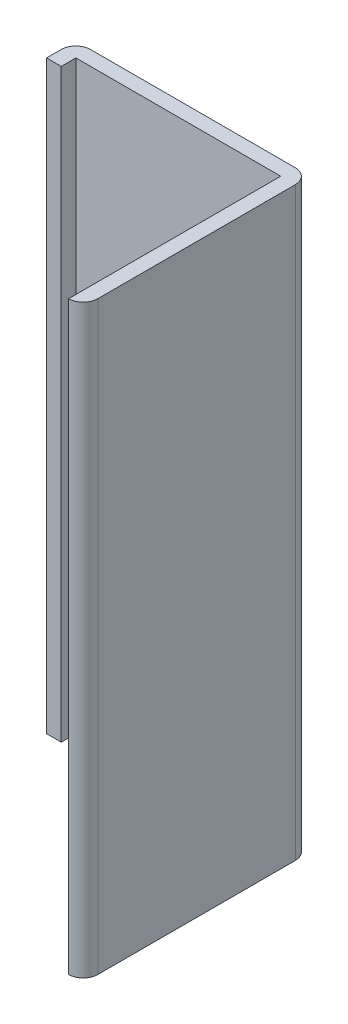
ISO-10303-21;
HEADER;
FILE_DESCRIPTION(('STEP AP214'),'2;1');
FILE_NAME('part.step','',(''),(''),'','','');
FILE_SCHEMA(('AUTOMOTIVE_DESIGN { 1 0 10303 214 1 1 1 1 }'));
ENDSEC;
DATA;
#1=APPLICATION_CONTEXT('core data for automotive mechanical design processes');
#2=APPLICATION_PROTOCOL_DEFINITION('international standard','automotive_design',2000,#1);
#3=PRODUCT_CONTEXT('',#1,'mechanical');
#4=PRODUCT('Part','Part','',(#3));
#5=PRODUCT_RELATED_PRODUCT_CATEGORY('part','',(#4));
#6=PRODUCT_DEFINITION_FORMATION('','',#4);
#7=PRODUCT_DEFINITION_CONTEXT('part definition',#1,'design');
#8=PRODUCT_DEFINITION('design','',#6,#7);
#9=PRODUCT_DEFINITION_SHAPE('','',#8);
#10=(LENGTH_UNIT() NAMED_UNIT(*) SI_UNIT(.MILLI.,.METRE.));
#11=(NAMED_UNIT(*) PLANE_ANGLE_UNIT() SI_UNIT($,.RADIAN.));
#12=(NAMED_UNIT(*) SI_UNIT($,.STERADIAN.) SOLID_ANGLE_UNIT());
#13=UNCERTAINTY_MEASURE_WITH_UNIT(LENGTH_MEASURE(1.E-05),#10,'distance_accuracy_value','');
#14=(GEOMETRIC_REPRESENTATION_CONTEXT(3) GLOBAL_UNCERTAINTY_ASSIGNED_CONTEXT((#13)) GLOBAL_UNIT_ASSIGNED_CONTEXT((#10,
#11,#12)) REPRESENTATION_CONTEXT('',''));
#15=CARTESIAN_POINT('',(0.,0.,0.));
#16=DIRECTION('',(0.,0.,1.));
#17=DIRECTION('',(1.,0.,0.));
#18=AXIS2_PLACEMENT_3D('',#15,#16,#17);
#19=CARTESIAN_POINT('',(2.5146,-1.016,0.0508));
#20=DIRECTION('',(0.,0.,-1.));
#21=DIRECTION('',(-1.,0.,0.));
#22=AXIS2_PLACEMENT_3D('',#19,#20,#21);
#23=PLANE('',#22);
#24=DIRECTION('',(0.,1.,0.));
#25=VECTOR('',#24,1.);
#26=CARTESIAN_POINT('',(3.2258,-1.016,0.0508));
#27=LINE('',#26,#25);
#28=CARTESIAN_POINT('',(3.2258,1.016,0.0508));
#29=VERTEX_POINT('',#28);
#30=CARTESIAN_POINT('',(3.2258,-1.016,0.0508));
#31=VERTEX_POINT('',#30);
#32=EDGE_CURVE('E166',#29,#31,#27,.F.);
#33=ORIENTED_EDGE('',*,*,#32,.F.);
#34=DIRECTION('',(-1.,0.,0.));
#35=VECTOR('',#34,1.);
#36=CARTESIAN_POINT('',(2.5146,1.016,0.0508));
#37=LINE('',#36,#35);
#38=CARTESIAN_POINT('',(2.5146,1.016,0.0508));
#39=VERTEX_POINT('',#38);
#40=EDGE_CURVE('E169',#39,#29,#37,.F.);
#41=ORIENTED_EDGE('',*,*,#40,.F.);
#42=DIRECTION('',(0.,1.,0.));
#43=VECTOR('',#42,1.);
#44=CARTESIAN_POINT('',(2.5146,-1.016,0.0508));
#45=LINE('',#44,#43);
#46=CARTESIAN_POINT('',(2.5146,-1.016,0.0508));
#47=VERTEX_POINT('',#46);
#48=EDGE_CURVE('E140',#39,#47,#45,.F.);
#49=ORIENTED_EDGE('',*,*,#48,.T.);
#50=DIRECTION('',(-1.,0.,0.));
#51=VECTOR('',#50,1.);
#52=CARTESIAN_POINT('',(2.5146,-1.016,0.0508));
#53=LINE('',#52,#51);
#54=EDGE_CURVE('E74',#31,#47,#53,.T.);
#55=ORIENTED_EDGE('',*,*,#54,.F.);
#56=EDGE_LOOP('',(#33,#41,#49,#55));
#57=FACE_BOUND('',#56,.T.);
#58=ADVANCED_FACE('F17',(#57),#23,.F.);
#59=CARTESIAN_POINT('',(3.2258,-1.016,0.7366));
#60=DIRECTION('',(1.,0.,0.));
#61=DIRECTION('',(0.,0.,-1.));
#62=AXIS2_PLACEMENT_3D('',#59,#60,#61);
#63=PLANE('',#62);
#64=DIRECTION('',(0.,-1.,0.));
#65=VECTOR('',#64,1.);
#66=CARTESIAN_POINT('',(3.2258,-1.016,0.7874));
#67=LINE('',#66,#65);
#68=CARTESIAN_POINT('',(3.2258,1.016,0.7874));
#69=VERTEX_POINT('',#68);
#70=CARTESIAN_POINT('',(3.2258,-1.016,0.7874));
#71=VERTEX_POINT('',#70);
#72=EDGE_CURVE('E131',#69,#71,#67,.T.);
#73=ORIENTED_EDGE('',*,*,#72,.F.);
#74=DIRECTION('',(0.,0.,-1.));
#75=VECTOR('',#74,1.);
#76=CARTESIAN_POINT('',(3.2258,1.016,0.7366));
#77=LINE('',#76,#75);
#78=EDGE_CURVE('E156',#29,#69,#77,.F.);
#79=ORIENTED_EDGE('',*,*,#78,.F.);
#80=ORIENTED_EDGE('',*,*,#32,.T.);
#81=DIRECTION('',(0.,0.,-1.));
#82=VECTOR('',#81,1.);
#83=CARTESIAN_POINT('',(3.2258,-1.016,0.7366));
#84=LINE('',#83,#82);
#85=EDGE_CURVE('E67',#71,#31,#84,.T.);
#86=ORIENTED_EDGE('',*,*,#85,.F.);
#87=EDGE_LOOP('',(#73,#79,#80,#86));
#88=FACE_BOUND('',#87,.T.);
#89=ADVANCED_FACE('F176',(#88),#63,.F.);
#90=CARTESIAN_POINT('',(2.5146,-1.016,0.1016));
#91=DIRECTION('',(-1.,0.,0.));
#92=DIRECTION('',(0.,0.,1.));
#93=AXIS2_PLACEMENT_3D('',#90,#91,#92);
#94=PLANE('',#93);
#95=ORIENTED_EDGE('',*,*,#48,.F.);
#96=DIRECTION('',(0.,0.,1.));
#97=VECTOR('',#96,1.);
#98=CARTESIAN_POINT('',(2.5146,1.016,0.1016));
#99=LINE('',#98,#97);
#100=CARTESIAN_POINT('',(2.5146,1.016,0.1016));
#101=VERTEX_POINT('',#100);
#102=EDGE_CURVE('E144',#101,#39,#99,.F.);
#103=ORIENTED_EDGE('',*,*,#102,.F.);
#104=DIRECTION('',(0.,1.,0.));
#105=VECTOR('',#104,1.);
#106=CARTESIAN_POINT('',(2.5146,-1.016,0.1016));
#107=LINE('',#106,#105);
#108=CARTESIAN_POINT('',(2.5146,-1.016,0.1016));
#109=VERTEX_POINT('',#108);
#110=EDGE_CURVE('E188',#101,#109,#107,.F.);
#111=ORIENTED_EDGE('',*,*,#110,.T.);
#112=DIRECTION('',(0.,0.,1.));
#113=VECTOR('',#112,1.);
#114=CARTESIAN_POINT('',(2.5146,-1.016,0.1016));
#115=LINE('',#114,#113);
#116=EDGE_CURVE('E138',#47,#109,#115,.T.);
#117=ORIENTED_EDGE('',*,*,#116,.F.);
#118=EDGE_LOOP('',(#95,#103,#111,#117));
#119=FACE_BOUND('',#118,.T.);
#120=ADVANCED_FACE('F187',(#119),#94,.F.);
#121=CARTESIAN_POINT('',(3.2258,-1.016,0.7366));
#122=DIRECTION('',(0.,-1.,0.));
#123=DIRECTION('',(0.,0.,-1.));
#124=AXIS2_PLACEMENT_3D('',#121,#122,#123);
#125=CYLINDRICAL_SURFACE('',#124,0.0508);
#126=CARTESIAN_POINT('',(3.2258,1.016,0.7366));
#127=DIRECTION('',(0.,-1.,0.));
#128=DIRECTION('',(0.,0.,-1.));
#129=AXIS2_PLACEMENT_3D('',#126,#127,#128);
#130=CIRCLE('',#129,0.0508);
#131=CARTESIAN_POINT('',(3.2766,1.016,0.7366));
#132=VERTEX_POINT('',#131);
#133=EDGE_CURVE('E130',#132,#69,#130,.T.);
#134=ORIENTED_EDGE('',*,*,#133,.T.);
#135=ORIENTED_EDGE('',*,*,#72,.T.);
#136=CARTESIAN_POINT('',(3.2258,-1.016,0.7366));
#137=DIRECTION('',(0.,-1.,0.));
#138=DIRECTION('',(0.,0.,-1.));
#139=AXIS2_PLACEMENT_3D('',#136,#137,#138);
#140=CIRCLE('',#139,0.0508);
#141=CARTESIAN_POINT('',(3.2766,-1.016,0.7366));
#142=VERTEX_POINT('',#141);
#143=EDGE_CURVE('E20',#71,#142,#140,.F.);
#144=ORIENTED_EDGE('',*,*,#143,.T.);
#145=DIRECTION('',(0.,1.,0.));
#146=VECTOR('',#145,1.);
#147=CARTESIAN_POINT('',(3.2766,-1.016,0.7366));
#148=LINE('',#147,#146);
#149=EDGE_CURVE('E191',#142,#132,#148,.T.);
#150=ORIENTED_EDGE('',*,*,#149,.T.);
#151=EDGE_LOOP('',(#134,#135,#144,#150));
#152=FACE_BOUND('',#151,.T.);
#153=ADVANCED_FACE('F235',(#152),#125,.T.);
#154=CARTESIAN_POINT('',(2.4638,-1.016,0.1016));
#155=DIRECTION('',(0.,0.,-1.));
#156=DIRECTION('',(-1.,0.,0.));
#157=AXIS2_PLACEMENT_3D('',#154,#155,#156);
#158=PLANE('',#157);
#159=ORIENTED_EDGE('',*,*,#110,.F.);
#160=DIRECTION('',(-1.,0.,0.));
#161=VECTOR('',#160,1.);
#162=CARTESIAN_POINT('',(2.4638,1.016,0.1016));
#163=LINE('',#162,#161);
#164=CARTESIAN_POINT('',(2.4638,1.016,0.1016));
#165=VERTEX_POINT('',#164);
#166=EDGE_CURVE('E135',#165,#101,#163,.F.);
#167=ORIENTED_EDGE('',*,*,#166,.F.);
#168=DIRECTION('',(0.,1.,0.));
#169=VECTOR('',#168,1.);
#170=CARTESIAN_POINT('',(2.4638,-1.016,0.1016));
#171=LINE('',#170,#169);
#172=CARTESIAN_POINT('',(2.4638,-1.016,0.1016));
#173=VERTEX_POINT('',#172);
#174=EDGE_CURVE('E106',#165,#173,#171,.F.);
#175=ORIENTED_EDGE('',*,*,#174,.T.);
#176=DIRECTION('',(-1.,0.,0.));
#177=VECTOR('',#176,1.);
#178=CARTESIAN_POINT('',(2.4638,-1.016,0.1016));
#179=LINE('',#178,#177);
#180=EDGE_CURVE('E101',#109,#173,#179,.T.);
#181=ORIENTED_EDGE('',*,*,#180,.F.);
#182=EDGE_LOOP('',(#159,#167,#175,#181));
#183=FACE_BOUND('',#182,.T.);
#184=ADVANCED_FACE('F190',(#183),#158,.F.);
#185=CARTESIAN_POINT('',(3.2766,-1.016,0.7366));
#186=DIRECTION('',(-1.,0.,0.));
#187=DIRECTION('',(0.,0.,1.));
#188=AXIS2_PLACEMENT_3D('',#185,#186,#187);
#189=PLANE('',#188);
#190=DIRECTION('',(0.,-1.,0.));
#191=VECTOR('',#190,1.);
#192=CARTESIAN_POINT('',(3.2766,-1.016,0.0508));
#193=LINE('',#192,#191);
#194=CARTESIAN_POINT('',(3.2766,1.016,0.0508));
#195=VERTEX_POINT('',#194);
#196=CARTESIAN_POINT('',(3.2766,-1.016,0.0508));
#197=VERTEX_POINT('',#196);
#198=EDGE_CURVE('E105',#195,#197,#193,.T.);
#199=ORIENTED_EDGE('',*,*,#198,.F.);
#200=DIRECTION('',(0.,0.,1.));
#201=VECTOR('',#200,1.);
#202=CARTESIAN_POINT('',(3.2766,1.016,0.7366));
#203=LINE('',#202,#201);
#204=EDGE_CURVE('E196',#132,#195,#203,.F.);
#205=ORIENTED_EDGE('',*,*,#204,.F.);
#206=ORIENTED_EDGE('',*,*,#149,.F.);
#207=DIRECTION('',(0.,0.,1.));
#208=VECTOR('',#207,1.);
#209=CARTESIAN_POINT('',(3.2766,-1.016,0.7366));
#210=LINE('',#209,#208);
#211=EDGE_CURVE('E93',#197,#142,#210,.T.);
#212=ORIENTED_EDGE('',*,*,#211,.F.);
#213=EDGE_LOOP('',(#199,#205,#206,#212));
#214=FACE_BOUND('',#213,.T.);
#215=ADVANCED_FACE('F224',(#214),#189,.F.);
#216=CARTESIAN_POINT('',(2.4638,-1.016,0.0508));
#217=DIRECTION('',(1.,0.,0.));
#218=DIRECTION('',(0.,0.,-1.));
#219=AXIS2_PLACEMENT_3D('',#216,#217,#218);
#220=PLANE('',#219);
#221=ORIENTED_EDGE('',*,*,#174,.F.);
#222=DIRECTION('',(0.,0.,-1.));
#223=VECTOR('',#222,1.);
#224=CARTESIAN_POINT('',(2.4638,1.016,0.0508));
#225=LINE('',#224,#223);
#226=CARTESIAN_POINT('',(2.4638,1.016,0.0508));
#227=VERTEX_POINT('',#226);
#228=EDGE_CURVE('E112',#165,#227,#225,.T.);
#229=ORIENTED_EDGE('',*,*,#228,.T.);
#230=DIRECTION('',(0.,-1.,0.));
#231=VECTOR('',#230,1.);
#232=CARTESIAN_POINT('',(2.4638,-1.016,0.0508));
#233=LINE('',#232,#231);
#234=CARTESIAN_POINT('',(2.4638,-1.016,0.0508));
#235=VERTEX_POINT('',#234);
#236=EDGE_CURVE('E109',#235,#227,#233,.F.);
#237=ORIENTED_EDGE('',*,*,#236,.F.);
#238=DIRECTION('',(0.,0.,-1.));
#239=VECTOR('',#238,1.);
#240=CARTESIAN_POINT('',(2.4638,-1.016,0.0508));
#241=LINE('',#240,#239);
#242=EDGE_CURVE('E97',#173,#235,#241,.T.);
#243=ORIENTED_EDGE('',*,*,#242,.F.);
#244=EDGE_LOOP('',(#221,#229,#237,#243));
#245=FACE_BOUND('',#244,.T.);
#246=ADVANCED_FACE('F110',(#245),#220,.F.);
#247=CARTESIAN_POINT('',(3.2258,-1.016,0.0508));
#248=DIRECTION('',(0.,-1.,0.));
#249=DIRECTION('',(0.,0.,-1.));
#250=AXIS2_PLACEMENT_3D('',#247,#248,#249);
#251=CYLINDRICAL_SURFACE('',#250,0.0508);
#252=CARTESIAN_POINT('',(3.2258,1.016,0.0508));
#253=DIRECTION('',(0.,-1.,0.));
#254=DIRECTION('',(0.,0.,-1.));
#255=AXIS2_PLACEMENT_3D('',#252,#253,#254);
#256=CIRCLE('',#255,0.0508);
#257=CARTESIAN_POINT('',(3.2258,1.016,0.));
#258=VERTEX_POINT('',#257);
#259=EDGE_CURVE('E116',#258,#195,#256,.T.);
#260=ORIENTED_EDGE('',*,*,#259,.T.);
#261=ORIENTED_EDGE('',*,*,#198,.T.);
#262=CARTESIAN_POINT('',(3.2258,-1.016,0.0508));
#263=DIRECTION('',(0.,-1.,0.));
#264=DIRECTION('',(0.,0.,-1.));
#265=AXIS2_PLACEMENT_3D('',#262,#263,#264);
#266=CIRCLE('',#265,0.0508);
#267=CARTESIAN_POINT('',(3.2258,-1.016,0.));
#268=VERTEX_POINT('',#267);
#269=EDGE_CURVE('E121',#268,#197,#266,.T.);
#270=ORIENTED_EDGE('',*,*,#269,.F.);
#271=DIRECTION('',(0.,1.,0.));
#272=VECTOR('',#271,1.);
#273=CARTESIAN_POINT('',(3.2258,-1.016,0.));
#274=LINE('',#273,#272);
#275=EDGE_CURVE('E124',#268,#258,#274,.T.);
#276=ORIENTED_EDGE('',*,*,#275,.T.);
#277=EDGE_LOOP('',(#260,#261,#270,#276));
#278=FACE_BOUND('',#277,.T.);
#279=ADVANCED_FACE('F219',(#278),#251,.T.);
#280=CARTESIAN_POINT('',(3.2258,1.016,0.0508));
#281=DIRECTION('',(0.,-1.,0.));
#282=DIRECTION('',(0.,0.,-1.));
#283=AXIS2_PLACEMENT_3D('',#280,#281,#282);
#284=PLANE('',#283);
#285=ORIENTED_EDGE('',*,*,#78,.T.);
#286=ORIENTED_EDGE('',*,*,#133,.F.);
#287=ORIENTED_EDGE('',*,*,#204,.T.);
#288=ORIENTED_EDGE('',*,*,#259,.F.);
#289=DIRECTION('',(1.,0.,0.));
#290=VECTOR('',#289,1.);
#291=CARTESIAN_POINT('',(3.2258,1.016,0.));
#292=LINE('',#291,#290);
#293=CARTESIAN_POINT('',(2.5146,1.016,0.));
#294=VERTEX_POINT('',#293);
#295=EDGE_CURVE('E212',#258,#294,#292,.F.);
#296=ORIENTED_EDGE('',*,*,#295,.T.);
#297=CARTESIAN_POINT('',(2.5146,1.016,0.0508));
#298=DIRECTION('',(0.,-1.,0.));
#299=DIRECTION('',(0.,0.,-1.));
#300=AXIS2_PLACEMENT_3D('',#297,#298,#299);
#301=CIRCLE('',#300,0.0508);
#302=EDGE_CURVE('E115',#227,#294,#301,.T.);
#303=ORIENTED_EDGE('',*,*,#302,.F.);
#304=ORIENTED_EDGE('',*,*,#228,.F.);
#305=ORIENTED_EDGE('',*,*,#166,.T.);
#306=ORIENTED_EDGE('',*,*,#102,.T.);
#307=ORIENTED_EDGE('',*,*,#40,.T.);
#308=EDGE_LOOP('',(#285,#286,#287,#288,#296,#303,#304,#305,#306,#307));
#309=FACE_BOUND('',#308,.T.);
#310=ADVANCED_FACE('F180',(#309),#284,.F.);
#311=CARTESIAN_POINT('',(2.5146,-1.016,0.0508));
#312=DIRECTION('',(0.,-1.,0.));
#313=DIRECTION('',(0.,0.,-1.));
#314=AXIS2_PLACEMENT_3D('',#311,#312,#313);
#315=CYLINDRICAL_SURFACE('',#314,0.0508);
#316=ORIENTED_EDGE('',*,*,#302,.T.);
#317=DIRECTION('',(0.,1.,0.));
#318=VECTOR('',#317,1.);
#319=CARTESIAN_POINT('',(2.5146,-1.016,0.));
#320=LINE('',#319,#318);
#321=CARTESIAN_POINT('',(2.5146,-1.016,0.));
#322=VERTEX_POINT('',#321);
#323=EDGE_CURVE('E26',#294,#322,#320,.F.);
#324=ORIENTED_EDGE('',*,*,#323,.T.);
#325=CARTESIAN_POINT('',(2.5146,-1.016,0.0508));
#326=DIRECTION('',(0.,-1.,0.));
#327=DIRECTION('',(0.,0.,-1.));
#328=AXIS2_PLACEMENT_3D('',#325,#326,#327);
#329=CIRCLE('',#328,0.0508);
#330=EDGE_CURVE('E34',#235,#322,#329,.T.);
#331=ORIENTED_EDGE('',*,*,#330,.F.);
#332=ORIENTED_EDGE('',*,*,#236,.T.);
#333=EDGE_LOOP('',(#316,#324,#331,#332));
#334=FACE_BOUND('',#333,.T.);
#335=ADVANCED_FACE('F119',(#334),#315,.T.);
#336=CARTESIAN_POINT('',(3.2258,-1.016,0.0508));
#337=DIRECTION('',(0.,-1.,0.));
#338=DIRECTION('',(0.,0.,-1.));
#339=AXIS2_PLACEMENT_3D('',#336,#337,#338);
#340=PLANE('',#339);
#341=ORIENTED_EDGE('',*,*,#85,.T.);
#342=ORIENTED_EDGE('',*,*,#54,.T.);
#343=ORIENTED_EDGE('',*,*,#116,.T.);
#344=ORIENTED_EDGE('',*,*,#180,.T.);
#345=ORIENTED_EDGE('',*,*,#242,.T.);
#346=ORIENTED_EDGE('',*,*,#330,.T.);
#347=DIRECTION('',(1.,0.,0.));
#348=VECTOR('',#347,1.);
#349=CARTESIAN_POINT('',(3.2258,-1.016,0.));
#350=LINE('',#349,#348);
#351=EDGE_CURVE('E11',#322,#268,#350,.T.);
#352=ORIENTED_EDGE('',*,*,#351,.T.);
#353=ORIENTED_EDGE('',*,*,#269,.T.);
#354=ORIENTED_EDGE('',*,*,#211,.T.);
#355=ORIENTED_EDGE('',*,*,#143,.F.);
#356=EDGE_LOOP('',(#341,#342,#343,#344,#345,#346,#352,#353,#354,#355));
#357=FACE_BOUND('',#356,.T.);
#358=ADVANCED_FACE('F99',(#357),#340,.T.);
#359=CARTESIAN_POINT('',(3.2258,-1.016,0.));
#360=DIRECTION('',(0.,0.,1.));
#361=DIRECTION('',(1.,0.,0.));
#362=AXIS2_PLACEMENT_3D('',#359,#360,#361);
#363=PLANE('',#362);
#364=ORIENTED_EDGE('',*,*,#323,.F.);
#365=ORIENTED_EDGE('',*,*,#295,.F.);
#366=ORIENTED_EDGE('',*,*,#275,.F.);
#367=ORIENTED_EDGE('',*,*,#351,.F.);
#368=EDGE_LOOP('',(#364,#365,#366,#367));
#369=FACE_BOUND('',#368,.T.);
#370=ADVANCED_FACE('F222',(#369),#363,.F.);
#371=CLOSED_SHELL('',(#58,#89,#120,#153,#184,#215,#246,#279,#310,#335,#358,#370));
#372=MANIFOLD_SOLID_BREP('B1',#371);
#373=ADVANCED_BREP_SHAPE_REPRESENTATION('',(#18,#372),#14);
#374=SHAPE_DEFINITION_REPRESENTATION(#9,#373);
ENDSEC;
END-ISO-10303-21;
